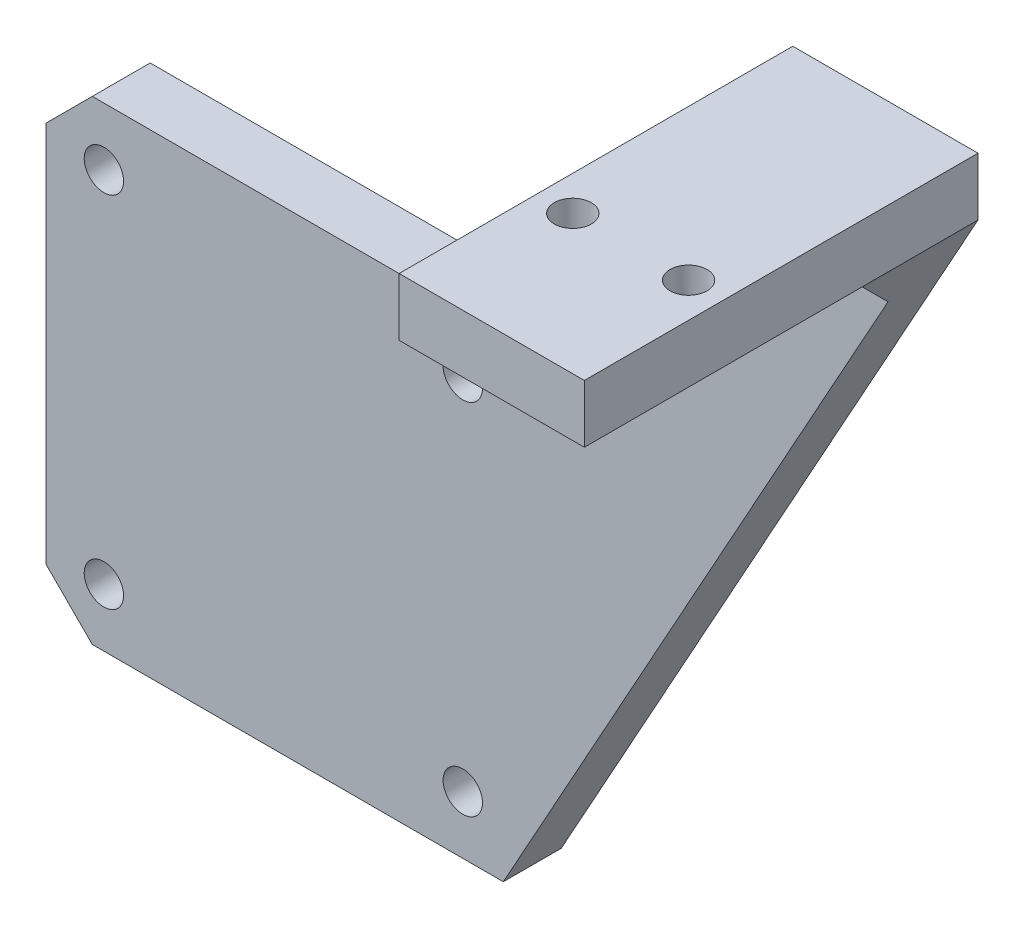
ISO-10303-21;
HEADER;
FILE_DESCRIPTION(('STEP AP214'),'2;1');
FILE_NAME('part.step','',(''),(''),'','','');
FILE_SCHEMA(('AUTOMOTIVE_DESIGN { 1 0 10303 214 1 1 1 1 }'));
ENDSEC;
DATA;
#1=APPLICATION_CONTEXT('core data for automotive mechanical design processes');
#2=APPLICATION_PROTOCOL_DEFINITION('international standard','automotive_design',2000,#1);
#3=PRODUCT_CONTEXT('',#1,'mechanical');
#4=PRODUCT('Part','Part','',(#3));
#5=PRODUCT_RELATED_PRODUCT_CATEGORY('part','',(#4));
#6=PRODUCT_DEFINITION_FORMATION('','',#4);
#7=PRODUCT_DEFINITION_CONTEXT('part definition',#1,'design');
#8=PRODUCT_DEFINITION('design','',#6,#7);
#9=PRODUCT_DEFINITION_SHAPE('','',#8);
#10=(LENGTH_UNIT() NAMED_UNIT(*) SI_UNIT(.MILLI.,.METRE.));
#11=(NAMED_UNIT(*) PLANE_ANGLE_UNIT() SI_UNIT($,.RADIAN.));
#12=(NAMED_UNIT(*) SI_UNIT($,.STERADIAN.) SOLID_ANGLE_UNIT());
#13=UNCERTAINTY_MEASURE_WITH_UNIT(LENGTH_MEASURE(1.E-05),#10,'distance_accuracy_value','');
#14=(GEOMETRIC_REPRESENTATION_CONTEXT(3) GLOBAL_UNCERTAINTY_ASSIGNED_CONTEXT((#13)) GLOBAL_UNIT_ASSIGNED_CONTEXT((#10,
#11,#12)) REPRESENTATION_CONTEXT('',''));
#15=CARTESIAN_POINT('',(0.,0.,0.));
#16=DIRECTION('',(0.,0.,1.));
#17=DIRECTION('',(1.,0.,0.));
#18=AXIS2_PLACEMENT_3D('',#15,#16,#17);
#19=CARTESIAN_POINT('',(45.9999989707705,64.9999989151536,0.));
#20=DIRECTION('',(1.,0.,0.));
#21=DIRECTION('',(0.,1.,0.));
#22=AXIS2_PLACEMENT_3D('',#19,#20,#21);
#23=PLANE('',#22);
#24=DIRECTION('',(0.,0.,1.));
#25=VECTOR('',#24,1.);
#26=CARTESIAN_POINT('',(45.9999989707705,70.0000002980232,0.));
#27=LINE('',#26,#25);
#28=CARTESIAN_POINT('',(45.9999989707705,70.0000002980232,0.));
#29=VERTEX_POINT('',#28);
#30=CARTESIAN_POINT('',(46.000000089407,70.0000002980232,33.9999998882413));
#31=VERTEX_POINT('',#30);
#32=EDGE_CURVE('E208',#29,#31,#27,.T.);
#33=ORIENTED_EDGE('',*,*,#32,.T.);
#34=DIRECTION('',(0.,1.,0.));
#35=VECTOR('',#34,1.);
#36=CARTESIAN_POINT('',(46.000000089407,70.0000002980232,33.9999998882413));
#37=LINE('',#36,#35);
#38=CARTESIAN_POINT('',(46.000000089407,64.9999976158142,33.9999998882413));
#39=VERTEX_POINT('',#38);
#40=EDGE_CURVE('E144',#39,#31,#37,.T.);
#41=ORIENTED_EDGE('',*,*,#40,.F.);
#42=DIRECTION('',(0.,0.,-1.));
#43=VECTOR('',#42,1.);
#44=CARTESIAN_POINT('',(46.000000089407,64.9999976158142,24.9999998882413));
#45=LINE('',#44,#43);
#46=CARTESIAN_POINT('',(45.9999989707705,64.9999989151536,9.9999997764826));
#47=VERTEX_POINT('',#46);
#48=EDGE_CURVE('E135',#39,#47,#45,.T.);
#49=ORIENTED_EDGE('',*,*,#48,.T.);
#50=DIRECTION('',(0.,0.,1.));
#51=VECTOR('',#50,1.);
#52=CARTESIAN_POINT('',(45.9999989707705,64.9999989151536,0.));
#53=LINE('',#52,#51);
#54=CARTESIAN_POINT('',(45.9999989707705,64.9999989151536,0.));
#55=VERTEX_POINT('',#54);
#56=EDGE_CURVE('E214',#55,#47,#53,.T.);
#57=ORIENTED_EDGE('',*,*,#56,.F.);
#58=DIRECTION('',(0.,1.,0.));
#59=VECTOR('',#58,1.);
#60=CARTESIAN_POINT('',(45.9999989707705,64.9999989151536,0.));
#61=LINE('',#60,#59);
#62=EDGE_CURVE('E193',#55,#29,#61,.T.);
#63=ORIENTED_EDGE('',*,*,#62,.T.);
#64=EDGE_LOOP('',(#33,#41,#49,#57,#63));
#65=FACE_BOUND('',#64,.T.);
#66=ADVANCED_FACE('F35',(#65),#23,.T.);
#67=CARTESIAN_POINT('',(9.99999977648259,6.79786807571676E-07,0.));
#68=DIRECTION('',(0.874791355106455,-0.484499829753337,0.));
#69=DIRECTION('',(0.484499829753337,0.874791355106455,0.));
#70=AXIS2_PLACEMENT_3D('',#67,#68,#69);
#71=PLANE('',#70);
#72=DIRECTION('',(0.484499829753337,0.874791355106455,0.));
#73=VECTOR('',#72,1.);
#74=CARTESIAN_POINT('',(9.99999977648259,6.79786807571676E-07,4.99999988824129));
#75=LINE('',#74,#73);
#76=CARTESIAN_POINT('',(9.99999977648259,6.79786807571676E-07,4.99999988824129));
#77=VERTEX_POINT('',#76);
#78=CARTESIAN_POINT('',(43.2307680464104,59.9999986588955,4.99999988824129));
#79=VERTEX_POINT('',#78);
#80=EDGE_CURVE('E197',#77,#79,#75,.T.);
#81=ORIENTED_EDGE('',*,*,#80,.F.);
#82=DIRECTION('',(0.,0.,1.));
#83=VECTOR('',#82,1.);
#84=CARTESIAN_POINT('',(9.99999977648259,6.79786807571676E-07,0.));
#85=LINE('',#84,#83);
#86=CARTESIAN_POINT('',(9.99999977648259,6.79786807571676E-07,0.));
#87=VERTEX_POINT('',#86);
#88=EDGE_CURVE('E217',#87,#77,#85,.T.);
#89=ORIENTED_EDGE('',*,*,#88,.F.);
#90=DIRECTION('',(0.484499829753337,0.874791355106455,0.));
#91=VECTOR('',#90,1.);
#92=CARTESIAN_POINT('',(9.99999977648259,6.79786807571676E-07,0.));
#93=LINE('',#92,#91);
#94=EDGE_CURVE('E205',#87,#55,#93,.T.);
#95=ORIENTED_EDGE('',*,*,#94,.T.);
#96=ORIENTED_EDGE('',*,*,#56,.T.);
#97=DIRECTION('',(-0.364660954138171,-0.658415608499491,-0.658415731138984));
#98=VECTOR('',#97,1.);
#99=CARTESIAN_POINT('',(45.9999984955852,64.9999980571802,10.0000002178486));
#100=LINE('',#99,#98);
#101=EDGE_CURVE('E233',#47,#79,#100,.T.);
#102=ORIENTED_EDGE('',*,*,#101,.T.);
#103=EDGE_LOOP('',(#81,#89,#95,#96,#102));
#104=FACE_BOUND('',#103,.T.);
#105=ADVANCED_FACE('F294',(#104),#71,.T.);
#106=CARTESIAN_POINT('',(-29.5000001788139,6.79786807571676E-07,0.));
#107=DIRECTION('',(0.,-1.,0.));
#108=DIRECTION('',(0.,0.,-1.));
#109=AXIS2_PLACEMENT_3D('',#106,#107,#108);
#110=PLANE('',#109);
#111=DIRECTION('',(1.,0.,0.));
#112=VECTOR('',#111,1.);
#113=CARTESIAN_POINT('',(-29.5000001788139,6.79786807571676E-07,4.99999988824129));
#114=LINE('',#113,#112);
#115=CARTESIAN_POINT('',(-25.499999592002,6.79786807571676E-07,4.99999988824129));
#116=VERTEX_POINT('',#115);
#117=EDGE_CURVE('E210',#116,#77,#114,.T.);
#118=ORIENTED_EDGE('',*,*,#117,.F.);
#119=DIRECTION('',(0.,0.,-1.));
#120=VECTOR('',#119,1.);
#121=CARTESIAN_POINT('',(-25.499999592002,6.79786807571676E-07,0.));
#122=LINE('',#121,#120);
#123=CARTESIAN_POINT('',(-25.499999592002,6.79786807571676E-07,0.));
#124=VERTEX_POINT('',#123);
#125=EDGE_CURVE('E45',#116,#124,#122,.T.);
#126=ORIENTED_EDGE('',*,*,#125,.T.);
#127=DIRECTION('',(1.,0.,0.));
#128=VECTOR('',#127,1.);
#129=CARTESIAN_POINT('',(-29.5000001788139,6.79786807571676E-07,0.));
#130=LINE('',#129,#128);
#131=EDGE_CURVE('E203',#124,#87,#130,.T.);
#132=ORIENTED_EDGE('',*,*,#131,.T.);
#133=ORIENTED_EDGE('',*,*,#88,.T.);
#134=EDGE_LOOP('',(#118,#126,#132,#133));
#135=FACE_BOUND('',#134,.T.);
#136=ADVANCED_FACE('F296',(#135),#110,.T.);
#137=CARTESIAN_POINT('',(-29.5000001788139,70.0000002980232,0.));
#138=DIRECTION('',(-1.,0.,0.));
#139=DIRECTION('',(0.,0.,1.));
#140=AXIS2_PLACEMENT_3D('',#137,#138,#139);
#141=PLANE('',#140);
#142=DIRECTION('',(0.,-1.,0.));
#143=VECTOR('',#142,1.);
#144=CARTESIAN_POINT('',(-29.5000001788139,70.0000002980232,0.));
#145=LINE('',#144,#143);
#146=CARTESIAN_POINT('',(-29.5000001788139,37.0000004768371,0.));
#147=VERTEX_POINT('',#146);
#148=CARTESIAN_POINT('',(-29.5000001788139,4.00000065565111,0.));
#149=VERTEX_POINT('',#148);
#150=EDGE_CURVE('E200',#147,#149,#145,.T.);
#151=ORIENTED_EDGE('',*,*,#150,.T.);
#152=DIRECTION('',(0.,0.,1.));
#153=VECTOR('',#152,1.);
#154=CARTESIAN_POINT('',(-29.5000001788139,4.00000065565111,0.));
#155=LINE('',#154,#153);
#156=CARTESIAN_POINT('',(-29.5000001788139,4.00000065565111,4.99999988824129));
#157=VERTEX_POINT('',#156);
#158=EDGE_CURVE('E237',#149,#157,#155,.T.);
#159=ORIENTED_EDGE('',*,*,#158,.T.);
#160=DIRECTION('',(0.,-1.,0.));
#161=VECTOR('',#160,1.);
#162=CARTESIAN_POINT('',(-29.5000001788139,70.0000002980232,4.99999988824129));
#163=LINE('',#162,#161);
#164=CARTESIAN_POINT('',(-29.5000001788139,37.0000004768371,4.99999988824129));
#165=VERTEX_POINT('',#164);
#166=EDGE_CURVE('E189',#165,#157,#163,.T.);
#167=ORIENTED_EDGE('',*,*,#166,.F.);
#168=DIRECTION('',(0.,0.,-1.));
#169=VECTOR('',#168,1.);
#170=CARTESIAN_POINT('',(-29.5000001788139,37.0000004768371,0.));
#171=LINE('',#170,#169);
#172=EDGE_CURVE('E225',#165,#147,#171,.T.);
#173=ORIENTED_EDGE('',*,*,#172,.T.);
#174=EDGE_LOOP('',(#151,#159,#167,#173));
#175=FACE_BOUND('',#174,.T.);
#176=ADVANCED_FACE('F270',(#175),#141,.T.);
#177=CARTESIAN_POINT('',(45.9999989707705,70.0000002980232,0.));
#178=DIRECTION('',(0.,1.,0.));
#179=DIRECTION('',(0.,0.,1.));
#180=AXIS2_PLACEMENT_3D('',#177,#178,#179);
#181=PLANE('',#180);
#182=CARTESIAN_POINT('',(42.9999997174528,70.0000002980232,21.9999997764826));
#183=DIRECTION('',(0.,1.,0.));
#184=DIRECTION('',(0.,0.,1.));
#185=AXIS2_PLACEMENT_3D('',#182,#183,#184);
#186=CIRCLE('',#185,1.59999999280066);
#187=CARTESIAN_POINT('',(42.9999997174528,70.0000002980232,23.5999997692833));
#188=VERTEX_POINT('',#187);
#189=EDGE_CURVE('E150',#188,#188,#186,.T.);
#190=ORIENTED_EDGE('',*,*,#189,.F.);
#191=EDGE_LOOP('',(#190));
#192=FACE_BOUND('',#191,.T.);
#193=CARTESIAN_POINT('',(32.9999997174528,70.0000002980232,21.9999997764826));
#194=DIRECTION('',(0.,1.,0.));
#195=DIRECTION('',(0.,0.,1.));
#196=AXIS2_PLACEMENT_3D('',#193,#194,#195);
#197=CIRCLE('',#196,1.6);
#198=CARTESIAN_POINT('',(32.9999997174528,70.0000002980232,23.5999997764826));
#199=VERTEX_POINT('',#198);
#200=EDGE_CURVE('E153',#199,#199,#197,.T.);
#201=ORIENTED_EDGE('',*,*,#200,.F.);
#202=EDGE_LOOP('',(#201));
#203=FACE_BOUND('',#202,.T.);
#204=DIRECTION('',(0.,0.,1.));
#205=VECTOR('',#204,1.);
#206=CARTESIAN_POINT('',(30.0000006408526,70.0000002980232,0.));
#207=LINE('',#206,#205);
#208=CARTESIAN_POINT('',(30.0000006408526,70.0000002980232,0.));
#209=VERTEX_POINT('',#208);
#210=CARTESIAN_POINT('',(29.9999993294477,70.0000002980232,33.9999998882413));
#211=VERTEX_POINT('',#210);
#212=EDGE_CURVE('E190',#209,#211,#207,.T.);
#213=ORIENTED_EDGE('',*,*,#212,.T.);
#214=DIRECTION('',(-1.,0.,0.));
#215=VECTOR('',#214,1.);
#216=CARTESIAN_POINT('',(29.9999993294477,70.0000002980232,33.9999998882413));
#217=LINE('',#216,#215);
#218=EDGE_CURVE('E149',#31,#211,#217,.T.);
#219=ORIENTED_EDGE('',*,*,#218,.F.);
#220=ORIENTED_EDGE('',*,*,#32,.F.);
#221=DIRECTION('',(-1.,0.,0.));
#222=VECTOR('',#221,1.);
#223=CARTESIAN_POINT('',(45.9999989707705,70.0000002980232,0.));
#224=LINE('',#223,#222);
#225=EDGE_CURVE('E196',#29,#209,#224,.T.);
#226=ORIENTED_EDGE('',*,*,#225,.T.);
#227=EDGE_LOOP('',(#213,#219,#220,#226));
#228=FACE_BOUND('',#227,.T.);
#229=ADVANCED_FACE('F288',(#192,#203,#228),#181,.T.);
#230=CARTESIAN_POINT('',(0.,0.,0.));
#231=DIRECTION('',(0.,0.,1.));
#232=DIRECTION('',(1.,0.,0.));
#233=AXIS2_PLACEMENT_3D('',#230,#231,#232);
#234=PLANE('',#233);
#235=CARTESIAN_POINT('',(6.50000013411045,35.9999984502792,0.));
#236=DIRECTION('',(0.,0.,-1.));
#237=DIRECTION('',(-1.,0.,0.));
#238=AXIS2_PLACEMENT_3D('',#235,#236,#237);
#239=CIRCLE('',#238,1.7);
#240=CARTESIAN_POINT('',(4.80000013411045,35.9999984502792,0.));
#241=VERTEX_POINT('',#240);
#242=EDGE_CURVE('E159',#241,#241,#239,.T.);
#243=ORIENTED_EDGE('',*,*,#242,.F.);
#244=EDGE_LOOP('',(#243));
#245=FACE_BOUND('',#244,.T.);
#246=CARTESIAN_POINT('',(-24.4999993592501,4.99999965541065,0.));
#247=DIRECTION('',(0.,0.,-1.));
#248=DIRECTION('',(-1.,0.,0.));
#249=AXIS2_PLACEMENT_3D('',#246,#247,#248);
#250=CIRCLE('',#249,1.7);
#251=CARTESIAN_POINT('',(-26.1999993592501,4.99999965541065,0.));
#252=VERTEX_POINT('',#251);
#253=EDGE_CURVE('E164',#252,#252,#250,.T.);
#254=ORIENTED_EDGE('',*,*,#253,.F.);
#255=EDGE_LOOP('',(#254));
#256=FACE_BOUND('',#255,.T.);
#257=CARTESIAN_POINT('',(6.50000013411045,4.99999965541065,0.));
#258=DIRECTION('',(0.,0.,-1.));
#259=DIRECTION('',(-1.,0.,0.));
#260=AXIS2_PLACEMENT_3D('',#257,#258,#259);
#261=CIRCLE('',#260,1.7);
#262=CARTESIAN_POINT('',(4.80000013411045,4.99999965541065,0.));
#263=VERTEX_POINT('',#262);
#264=EDGE_CURVE('E160',#263,#263,#261,.T.);
#265=ORIENTED_EDGE('',*,*,#264,.F.);
#266=EDGE_LOOP('',(#265));
#267=FACE_BOUND('',#266,.T.);
#268=CARTESIAN_POINT('',(-24.4999988935888,35.9999984502792,0.));
#269=DIRECTION('',(0.,0.,-1.));
#270=DIRECTION('',(-1.,0.,0.));
#271=AXIS2_PLACEMENT_3D('',#268,#269,#270);
#272=CIRCLE('',#271,1.7);
#273=CARTESIAN_POINT('',(-26.1999988935888,35.9999984502792,0.));
#274=VERTEX_POINT('',#273);
#275=EDGE_CURVE('E163',#274,#274,#272,.T.);
#276=ORIENTED_EDGE('',*,*,#275,.F.);
#277=EDGE_LOOP('',(#276));
#278=FACE_BOUND('',#277,.T.);
#279=ORIENTED_EDGE('',*,*,#131,.F.);
#280=DIRECTION('',(0.70710683518719,-0.707106727185901,0.));
#281=VECTOR('',#280,1.);
#282=CARTESIAN_POINT('',(-29.5000001788139,4.00000065565111,0.));
#283=LINE('',#282,#281);
#284=EDGE_CURVE('E11',#124,#149,#283,.F.);
#285=ORIENTED_EDGE('',*,*,#284,.T.);
#286=ORIENTED_EDGE('',*,*,#150,.F.);
#287=DIRECTION('',(0.707106781186545,0.70710678118655,0.));
#288=VECTOR('',#287,1.);
#289=CARTESIAN_POINT('',(-25.4999995231628,41.0000011324883,0.));
#290=LINE('',#289,#288);
#291=CARTESIAN_POINT('',(-25.4999995231628,41.0000011324883,0.));
#292=VERTEX_POINT('',#291);
#293=EDGE_CURVE('E227',#147,#292,#290,.T.);
#294=ORIENTED_EDGE('',*,*,#293,.T.);
#295=DIRECTION('',(1.,0.,0.));
#296=VECTOR('',#295,1.);
#297=CARTESIAN_POINT('',(-29.5000001788139,41.0000011324883,0.));
#298=LINE('',#297,#296);
#299=CARTESIAN_POINT('',(9.99999977648258,41.0000011324883,0.));
#300=VERTEX_POINT('',#299);
#301=EDGE_CURVE('E181',#292,#300,#298,.T.);
#302=ORIENTED_EDGE('',*,*,#301,.T.);
#303=DIRECTION('',(0.64018448855706,0.768221205520217,0.));
#304=VECTOR('',#303,1.);
#305=CARTESIAN_POINT('',(9.99999977648258,41.0000011324883,0.));
#306=LINE('',#305,#304);
#307=CARTESIAN_POINT('',(30.0000006408526,64.9999965229768,0.));
#308=VERTEX_POINT('',#307);
#309=EDGE_CURVE('E174',#300,#308,#306,.T.);
#310=ORIENTED_EDGE('',*,*,#309,.T.);
#311=DIRECTION('',(0.,1.,0.));
#312=VECTOR('',#311,1.);
#313=CARTESIAN_POINT('',(30.0000006408526,64.9999965229768,0.));
#314=LINE('',#313,#312);
#315=EDGE_CURVE('E177',#308,#209,#314,.T.);
#316=ORIENTED_EDGE('',*,*,#315,.T.);
#317=ORIENTED_EDGE('',*,*,#225,.F.);
#318=ORIENTED_EDGE('',*,*,#62,.F.);
#319=ORIENTED_EDGE('',*,*,#94,.F.);
#320=EDGE_LOOP('',(#279,#285,#286,#294,#302,#310,#316,#317,#318,#319));
#321=FACE_BOUND('',#320,.T.);
#322=ADVANCED_FACE('F260',(#245,#256,#267,#278,#321),#234,.F.);
#323=CARTESIAN_POINT('',(0.,0.,4.99999988824129));
#324=DIRECTION('',(0.,0.,1.));
#325=DIRECTION('',(1.,0.,0.));
#326=AXIS2_PLACEMENT_3D('',#323,#324,#325);
#327=PLANE('',#326);
#328=CARTESIAN_POINT('',(6.50000013411045,35.9999984502792,4.99999988824129));
#329=DIRECTION('',(0.,0.,1.));
#330=DIRECTION('',(1.,0.,0.));
#331=AXIS2_PLACEMENT_3D('',#328,#329,#330);
#332=CIRCLE('',#331,1.7);
#333=CARTESIAN_POINT('',(8.20000013411045,35.9999984502792,4.99999988824129));
#334=VERTEX_POINT('',#333);
#335=EDGE_CURVE('E40',#334,#334,#332,.T.);
#336=ORIENTED_EDGE('',*,*,#335,.F.);
#337=EDGE_LOOP('',(#336));
#338=FACE_BOUND('',#337,.T.);
#339=CARTESIAN_POINT('',(-24.4999993592501,4.99999965541065,4.99999988824129));
#340=DIRECTION('',(0.,0.,1.));
#341=DIRECTION('',(1.,0.,0.));
#342=AXIS2_PLACEMENT_3D('',#339,#340,#341);
#343=CIRCLE('',#342,1.7);
#344=CARTESIAN_POINT('',(-22.7999993592501,4.99999965541065,4.99999988824129));
#345=VERTEX_POINT('',#344);
#346=EDGE_CURVE('E246',#345,#345,#343,.T.);
#347=ORIENTED_EDGE('',*,*,#346,.F.);
#348=EDGE_LOOP('',(#347));
#349=FACE_BOUND('',#348,.T.);
#350=CARTESIAN_POINT('',(6.50000013411045,4.99999965541065,4.99999988824129));
#351=DIRECTION('',(0.,0.,1.));
#352=DIRECTION('',(1.,0.,0.));
#353=AXIS2_PLACEMENT_3D('',#350,#351,#352);
#354=CIRCLE('',#353,1.7);
#355=CARTESIAN_POINT('',(8.20000013411045,4.99999965541065,4.99999988824129));
#356=VERTEX_POINT('',#355);
#357=EDGE_CURVE('E244',#356,#356,#354,.T.);
#358=ORIENTED_EDGE('',*,*,#357,.F.);
#359=EDGE_LOOP('',(#358));
#360=FACE_BOUND('',#359,.T.);
#361=CARTESIAN_POINT('',(-24.4999988935888,35.9999984502792,4.99999988824129));
#362=DIRECTION('',(0.,0.,1.));
#363=DIRECTION('',(1.,0.,0.));
#364=AXIS2_PLACEMENT_3D('',#361,#362,#363);
#365=CIRCLE('',#364,1.7);
#366=CARTESIAN_POINT('',(-22.7999988935888,35.9999984502792,4.99999988824129));
#367=VERTEX_POINT('',#366);
#368=EDGE_CURVE('E170',#367,#367,#365,.T.);
#369=ORIENTED_EDGE('',*,*,#368,.F.);
#370=EDGE_LOOP('',(#369));
#371=FACE_BOUND('',#370,.T.);
#372=ORIENTED_EDGE('',*,*,#166,.T.);
#373=DIRECTION('',(-0.70710683518719,0.707106727185901,0.));
#374=VECTOR('',#373,1.);
#375=CARTESIAN_POINT('',(-12.7499975087123,-12.7499994561074,4.99999988824129));
#376=LINE('',#375,#374);
#377=EDGE_CURVE('E60',#157,#116,#376,.F.);
#378=ORIENTED_EDGE('',*,*,#377,.T.);
#379=ORIENTED_EDGE('',*,*,#117,.T.);
#380=ORIENTED_EDGE('',*,*,#80,.T.);
#381=DIRECTION('',(-1.,0.,0.));
#382=VECTOR('',#381,1.);
#383=CARTESIAN_POINT('',(0.,59.9999986588955,4.99999988824129));
#384=LINE('',#383,#382);
#385=CARTESIAN_POINT('',(25.8333347737789,59.9999986588955,4.99999988824129));
#386=VERTEX_POINT('',#385);
#387=EDGE_CURVE('E231',#79,#386,#384,.T.);
#388=ORIENTED_EDGE('',*,*,#387,.T.);
#389=DIRECTION('',(0.640184488557059,0.768221205520217,0.));
#390=VECTOR('',#389,1.);
#391=CARTESIAN_POINT('',(25.8333347737789,59.9999986588955,4.99999988824129));
#392=LINE('',#391,#390);
#393=CARTESIAN_POINT('',(9.9999997764826,41.0000011324883,4.99999988824129));
#394=VERTEX_POINT('',#393);
#395=EDGE_CURVE('E173',#394,#386,#392,.T.);
#396=ORIENTED_EDGE('',*,*,#395,.F.);
#397=DIRECTION('',(1.,0.,0.));
#398=VECTOR('',#397,1.);
#399=CARTESIAN_POINT('',(-29.5000001788139,41.0000011324883,4.99999988824129));
#400=LINE('',#399,#398);
#401=CARTESIAN_POINT('',(-25.4999995231628,41.0000011324883,4.99999988824129));
#402=VERTEX_POINT('',#401);
#403=EDGE_CURVE('E178',#402,#394,#400,.T.);
#404=ORIENTED_EDGE('',*,*,#403,.F.);
#405=DIRECTION('',(-0.707106781186545,-0.70710678118655,0.));
#406=VECTOR('',#405,1.);
#407=CARTESIAN_POINT('',(-33.2500003278256,33.2500003278254,4.99999988824129));
#408=LINE('',#407,#406);
#409=EDGE_CURVE('E223',#402,#165,#408,.T.);
#410=ORIENTED_EDGE('',*,*,#409,.T.);
#411=EDGE_LOOP('',(#372,#378,#379,#380,#388,#396,#404,#410));
#412=FACE_BOUND('',#411,.T.);
#413=ADVANCED_FACE('F256',(#338,#349,#360,#371,#412),#327,.T.);
#414=CARTESIAN_POINT('',(-29.5000001788139,41.0000011324883,0.));
#415=DIRECTION('',(0.,-1.,0.));
#416=DIRECTION('',(0.,0.,-1.));
#417=AXIS2_PLACEMENT_3D('',#414,#415,#416);
#418=PLANE('',#417);
#419=ORIENTED_EDGE('',*,*,#301,.F.);
#420=DIRECTION('',(0.,0.,1.));
#421=VECTOR('',#420,1.);
#422=CARTESIAN_POINT('',(-25.4999995231628,41.0000011324883,4.99999988824129));
#423=LINE('',#422,#421);
#424=EDGE_CURVE('E216',#292,#402,#423,.T.);
#425=ORIENTED_EDGE('',*,*,#424,.T.);
#426=ORIENTED_EDGE('',*,*,#403,.T.);
#427=DIRECTION('',(0.,0.,1.));
#428=VECTOR('',#427,1.);
#429=CARTESIAN_POINT('',(9.99999977648258,41.0000011324883,0.));
#430=LINE('',#429,#428);
#431=EDGE_CURVE('E186',#300,#394,#430,.T.);
#432=ORIENTED_EDGE('',*,*,#431,.F.);
#433=EDGE_LOOP('',(#419,#425,#426,#432));
#434=FACE_BOUND('',#433,.T.);
#435=ADVANCED_FACE('F259',(#434),#418,.F.);
#436=CARTESIAN_POINT('',(30.0000006408526,64.9999965229768,0.));
#437=DIRECTION('',(1.,0.,0.));
#438=DIRECTION('',(0.,0.,-1.));
#439=AXIS2_PLACEMENT_3D('',#436,#437,#438);
#440=PLANE('',#439);
#441=DIRECTION('',(0.,0.,1.));
#442=VECTOR('',#441,1.);
#443=CARTESIAN_POINT('',(30.0000006408526,64.9999965229768,0.));
#444=LINE('',#443,#442);
#445=CARTESIAN_POINT('',(29.9999993294477,64.9999976158142,9.9999997764826));
#446=VERTEX_POINT('',#445);
#447=EDGE_CURVE('E131',#308,#446,#444,.T.);
#448=ORIENTED_EDGE('',*,*,#447,.T.);
#449=DIRECTION('',(0.,0.,-1.));
#450=VECTOR('',#449,1.);
#451=CARTESIAN_POINT('',(29.9999993294477,64.9999976158142,24.9999998882413));
#452=LINE('',#451,#450);
#453=CARTESIAN_POINT('',(29.9999993294477,64.9999976158142,33.9999998882413));
#454=VERTEX_POINT('',#453);
#455=EDGE_CURVE('E125',#454,#446,#452,.T.);
#456=ORIENTED_EDGE('',*,*,#455,.F.);
#457=DIRECTION('',(0.,-1.,0.));
#458=VECTOR('',#457,1.);
#459=CARTESIAN_POINT('',(29.9999993294477,70.0000002980232,33.9999998882413));
#460=LINE('',#459,#458);
#461=EDGE_CURVE('E129',#211,#454,#460,.T.);
#462=ORIENTED_EDGE('',*,*,#461,.F.);
#463=ORIENTED_EDGE('',*,*,#212,.F.);
#464=ORIENTED_EDGE('',*,*,#315,.F.);
#465=EDGE_LOOP('',(#448,#456,#462,#463,#464));
#466=FACE_BOUND('',#465,.T.);
#467=ADVANCED_FACE('F127',(#466),#440,.F.);
#468=CARTESIAN_POINT('',(25.8333347737789,59.9999986588955,0.));
#469=DIRECTION('',(0.768221205520217,-0.640184488557059,0.));
#470=DIRECTION('',(0.64018448855706,0.768221205520218,0.));
#471=AXIS2_PLACEMENT_3D('',#468,#469,#470);
#472=PLANE('',#471);
#473=ORIENTED_EDGE('',*,*,#395,.T.);
#474=DIRECTION('',(0.507673136132828,0.609207620024098,0.609207733497887));
#475=VECTOR('',#474,1.);
#476=CARTESIAN_POINT('',(24.2869428052372,58.1443287332503,3.14432961695058));
#477=LINE('',#476,#475);
#478=EDGE_CURVE('E235',#386,#446,#477,.T.);
#479=ORIENTED_EDGE('',*,*,#478,.T.);
#480=ORIENTED_EDGE('',*,*,#447,.F.);
#481=ORIENTED_EDGE('',*,*,#309,.F.);
#482=ORIENTED_EDGE('',*,*,#431,.T.);
#483=EDGE_LOOP('',(#473,#479,#480,#481,#482));
#484=FACE_BOUND('',#483,.T.);
#485=ADVANCED_FACE('F284',(#484),#472,.F.);
#486=CARTESIAN_POINT('',(46.000000089407,64.9999976158142,24.9999998882413));
#487=DIRECTION('',(0.,1.,0.));
#488=DIRECTION('',(0.,0.,1.));
#489=AXIS2_PLACEMENT_3D('',#486,#487,#488);
#490=PLANE('',#489);
#491=CARTESIAN_POINT('',(42.9999997174528,64.9999976158142,21.9999997764826));
#492=DIRECTION('',(0.,-1.,0.));
#493=DIRECTION('',(0.,0.,-1.));
#494=AXIS2_PLACEMENT_3D('',#491,#492,#493);
#495=CIRCLE('',#494,1.59999999280066);
#496=CARTESIAN_POINT('',(42.9999997174528,64.9999976158142,20.3999997836819));
#497=VERTEX_POINT('',#496);
#498=EDGE_CURVE('E361',#497,#497,#495,.T.);
#499=ORIENTED_EDGE('',*,*,#498,.F.);
#500=EDGE_LOOP('',(#499));
#501=FACE_BOUND('',#500,.T.);
#502=CARTESIAN_POINT('',(32.9999997174528,64.9999976158142,21.9999997764826));
#503=DIRECTION('',(0.,-1.,0.));
#504=DIRECTION('',(0.,0.,-1.));
#505=AXIS2_PLACEMENT_3D('',#502,#503,#504);
#506=CIRCLE('',#505,1.6);
#507=CARTESIAN_POINT('',(32.9999997174528,64.9999976158142,20.3999997764826));
#508=VERTEX_POINT('',#507);
#509=EDGE_CURVE('E363',#508,#508,#506,.T.);
#510=ORIENTED_EDGE('',*,*,#509,.F.);
#511=EDGE_LOOP('',(#510));
#512=FACE_BOUND('',#511,.T.);
#513=ORIENTED_EDGE('',*,*,#455,.T.);
#514=DIRECTION('',(1.,0.,0.));
#515=VECTOR('',#514,1.);
#516=CARTESIAN_POINT('',(46.000000089407,64.9999976158142,9.9999997764826));
#517=LINE('',#516,#515);
#518=EDGE_CURVE('E229',#446,#47,#517,.T.);
#519=ORIENTED_EDGE('',*,*,#518,.T.);
#520=ORIENTED_EDGE('',*,*,#48,.F.);
#521=DIRECTION('',(1.,0.,0.));
#522=VECTOR('',#521,1.);
#523=CARTESIAN_POINT('',(29.9999993294477,64.9999976158142,33.9999998882413));
#524=LINE('',#523,#522);
#525=EDGE_CURVE('E138',#454,#39,#524,.T.);
#526=ORIENTED_EDGE('',*,*,#525,.F.);
#527=EDGE_LOOP('',(#513,#519,#520,#526));
#528=FACE_BOUND('',#527,.T.);
#529=ADVANCED_FACE('F139',(#501,#512,#528),#490,.F.);
#530=CARTESIAN_POINT('',(-25.4999995231628,41.0000011324883,0.));
#531=DIRECTION('',(-0.70710678118655,0.707106781186545,0.));
#532=DIRECTION('',(0.,0.,-1.));
#533=AXIS2_PLACEMENT_3D('',#530,#531,#532);
#534=PLANE('',#533);
#535=ORIENTED_EDGE('',*,*,#293,.F.);
#536=ORIENTED_EDGE('',*,*,#172,.F.);
#537=ORIENTED_EDGE('',*,*,#409,.F.);
#538=ORIENTED_EDGE('',*,*,#424,.F.);
#539=EDGE_LOOP('',(#535,#536,#537,#538));
#540=FACE_BOUND('',#539,.T.);
#541=ADVANCED_FACE('F275',(#540),#534,.T.);
#542=CARTESIAN_POINT('',(46.000000089407,64.9999976158142,9.9999997764826));
#543=DIRECTION('',(0.,0.707106847041005,-0.707106715332084));
#544=DIRECTION('',(1.,0.,0.));
#545=AXIS2_PLACEMENT_3D('',#542,#543,#544);
#546=PLANE('',#545);
#547=ORIENTED_EDGE('',*,*,#478,.F.);
#548=ORIENTED_EDGE('',*,*,#387,.F.);
#549=ORIENTED_EDGE('',*,*,#101,.F.);
#550=ORIENTED_EDGE('',*,*,#518,.F.);
#551=EDGE_LOOP('',(#547,#548,#549,#550));
#552=FACE_BOUND('',#551,.T.);
#553=ADVANCED_FACE('F301',(#552),#546,.F.);
#554=CARTESIAN_POINT('',(-29.5000001788139,4.00000065565111,0.));
#555=DIRECTION('',(0.707106727185901,0.70710683518719,0.));
#556=DIRECTION('',(0.,0.,1.));
#557=AXIS2_PLACEMENT_3D('',#554,#555,#556);
#558=PLANE('',#557);
#559=ORIENTED_EDGE('',*,*,#284,.F.);
#560=ORIENTED_EDGE('',*,*,#125,.F.);
#561=ORIENTED_EDGE('',*,*,#377,.F.);
#562=ORIENTED_EDGE('',*,*,#158,.F.);
#563=EDGE_LOOP('',(#559,#560,#561,#562));
#564=FACE_BOUND('',#563,.T.);
#565=ADVANCED_FACE('F38',(#564),#558,.F.);
#566=CARTESIAN_POINT('',(-24.4999988935888,35.9999984502792,10.));
#567=DIRECTION('',(0.,0.,-1.));
#568=DIRECTION('',(-1.,0.,0.));
#569=AXIS2_PLACEMENT_3D('',#566,#567,#568);
#570=CYLINDRICAL_SURFACE('',#569,1.7);
#571=ORIENTED_EDGE('',*,*,#368,.T.);
#572=EDGE_LOOP('',(#571));
#573=FACE_BOUND('',#572,.T.);
#574=ORIENTED_EDGE('',*,*,#275,.T.);
#575=EDGE_LOOP('',(#574));
#576=FACE_BOUND('',#575,.T.);
#577=ADVANCED_FACE('F300',(#573,#576),#570,.F.);
#578=CARTESIAN_POINT('',(6.50000013411045,4.99999965541065,10.));
#579=DIRECTION('',(0.,0.,-1.));
#580=DIRECTION('',(-1.,0.,0.));
#581=AXIS2_PLACEMENT_3D('',#578,#579,#580);
#582=CYLINDRICAL_SURFACE('',#581,1.7);
#583=ORIENTED_EDGE('',*,*,#357,.T.);
#584=EDGE_LOOP('',(#583));
#585=FACE_BOUND('',#584,.T.);
#586=ORIENTED_EDGE('',*,*,#264,.T.);
#587=EDGE_LOOP('',(#586));
#588=FACE_BOUND('',#587,.T.);
#589=ADVANCED_FACE('F306',(#585,#588),#582,.F.);
#590=CARTESIAN_POINT('',(-24.4999993592501,4.99999965541065,10.));
#591=DIRECTION('',(0.,0.,-1.));
#592=DIRECTION('',(-1.,0.,0.));
#593=AXIS2_PLACEMENT_3D('',#590,#591,#592);
#594=CYLINDRICAL_SURFACE('',#593,1.7);
#595=ORIENTED_EDGE('',*,*,#346,.T.);
#596=EDGE_LOOP('',(#595));
#597=FACE_BOUND('',#596,.T.);
#598=ORIENTED_EDGE('',*,*,#253,.T.);
#599=EDGE_LOOP('',(#598));
#600=FACE_BOUND('',#599,.T.);
#601=ADVANCED_FACE('F383',(#597,#600),#594,.F.);
#602=CARTESIAN_POINT('',(6.50000013411045,35.9999984502792,10.));
#603=DIRECTION('',(0.,0.,-1.));
#604=DIRECTION('',(-1.,0.,0.));
#605=AXIS2_PLACEMENT_3D('',#602,#603,#604);
#606=CYLINDRICAL_SURFACE('',#605,1.7);
#607=ORIENTED_EDGE('',*,*,#335,.T.);
#608=EDGE_LOOP('',(#607));
#609=FACE_BOUND('',#608,.T.);
#610=ORIENTED_EDGE('',*,*,#242,.T.);
#611=EDGE_LOOP('',(#610));
#612=FACE_BOUND('',#611,.T.);
#613=ADVANCED_FACE('F253',(#609,#612),#606,.F.);
#614=CARTESIAN_POINT('',(0.,0.,33.9999998882413));
#615=DIRECTION('',(0.,0.,1.));
#616=DIRECTION('',(1.,0.,0.));
#617=AXIS2_PLACEMENT_3D('',#614,#615,#616);
#618=PLANE('',#617);
#619=ORIENTED_EDGE('',*,*,#461,.T.);
#620=ORIENTED_EDGE('',*,*,#525,.T.);
#621=ORIENTED_EDGE('',*,*,#40,.T.);
#622=ORIENTED_EDGE('',*,*,#218,.T.);
#623=EDGE_LOOP('',(#619,#620,#621,#622));
#624=FACE_BOUND('',#623,.T.);
#625=ADVANCED_FACE('F147',(#624),#618,.T.);
#626=CARTESIAN_POINT('',(32.9999997174528,73.9999976158142,21.9999997764826));
#627=DIRECTION('',(0.,-1.,0.));
#628=DIRECTION('',(0.,0.,-1.));
#629=AXIS2_PLACEMENT_3D('',#626,#627,#628);
#630=CYLINDRICAL_SURFACE('',#629,1.6);
#631=ORIENTED_EDGE('',*,*,#200,.T.);
#632=EDGE_LOOP('',(#631));
#633=FACE_BOUND('',#632,.T.);
#634=ORIENTED_EDGE('',*,*,#509,.T.);
#635=EDGE_LOOP('',(#634));
#636=FACE_BOUND('',#635,.T.);
#637=ADVANCED_FACE('F369',(#633,#636),#630,.F.);
#638=CARTESIAN_POINT('',(42.9999997174528,73.9999976158142,21.9999997764826));
#639=DIRECTION('',(0.,-1.,0.));
#640=DIRECTION('',(0.,0.,-1.));
#641=AXIS2_PLACEMENT_3D('',#638,#639,#640);
#642=CYLINDRICAL_SURFACE('',#641,1.59999999280066);
#643=ORIENTED_EDGE('',*,*,#189,.T.);
#644=EDGE_LOOP('',(#643));
#645=FACE_BOUND('',#644,.T.);
#646=ORIENTED_EDGE('',*,*,#498,.T.);
#647=EDGE_LOOP('',(#646));
#648=FACE_BOUND('',#647,.T.);
#649=ADVANCED_FACE('F371',(#645,#648),#642,.F.);
#650=CLOSED_SHELL('',(#66,#105,#136,#176,#229,#322,#413,#435,#467,#485,#529,#541,#553,#565,#577,
#589,#601,#613,#625,#637,#649));
#651=MANIFOLD_SOLID_BREP('B2',#650);
#652=ADVANCED_BREP_SHAPE_REPRESENTATION('',(#18,#651),#14);
#653=SHAPE_DEFINITION_REPRESENTATION(#9,#652);
ENDSEC;
END-ISO-10303-21;
